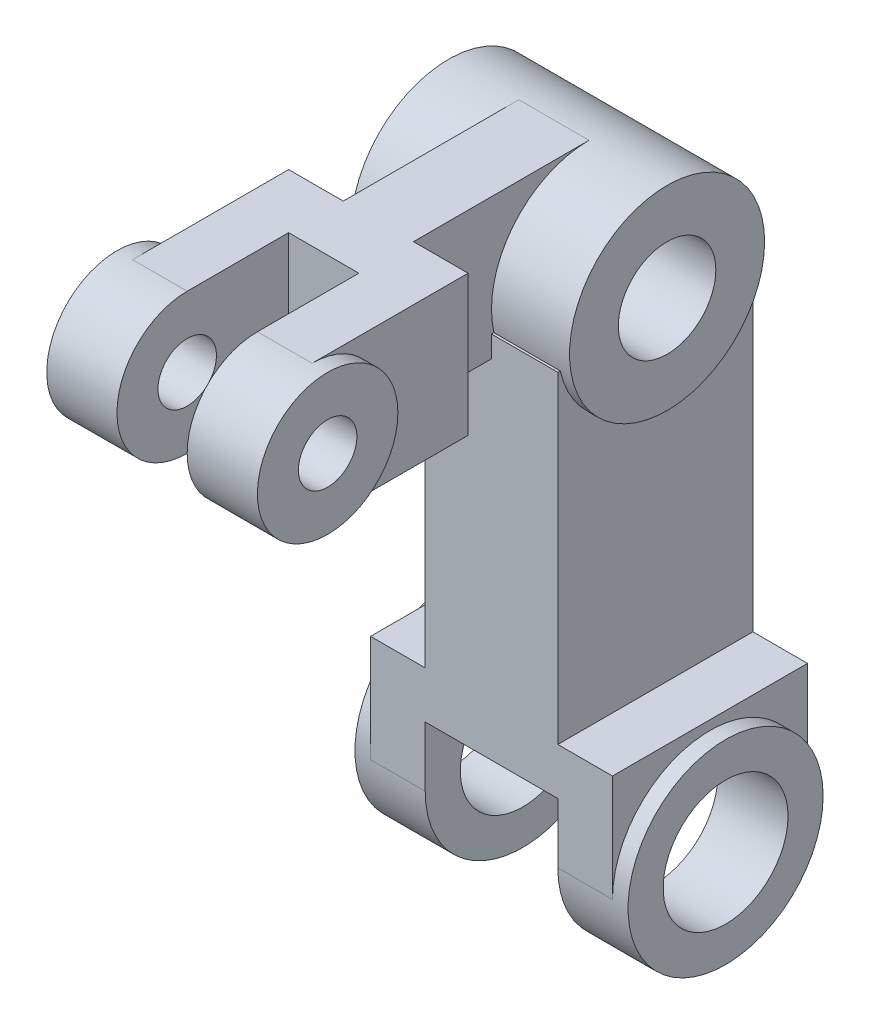
ISO-10303-21;
HEADER;
FILE_DESCRIPTION(('STEP AP214'),'2;1');
FILE_NAME('part.step','',(''),(''),'','','');
FILE_SCHEMA(('AUTOMOTIVE_DESIGN { 1 0 10303 214 1 1 1 1 }'));
ENDSEC;
DATA;
#1=APPLICATION_CONTEXT('core data for automotive mechanical design processes');
#2=APPLICATION_PROTOCOL_DEFINITION('international standard','automotive_design',2000,#1);
#3=PRODUCT_CONTEXT('',#1,'mechanical');
#4=PRODUCT('Part','Part','',(#3));
#5=PRODUCT_RELATED_PRODUCT_CATEGORY('part','',(#4));
#6=PRODUCT_DEFINITION_FORMATION('','',#4);
#7=PRODUCT_DEFINITION_CONTEXT('part definition',#1,'design');
#8=PRODUCT_DEFINITION('design','',#6,#7);
#9=PRODUCT_DEFINITION_SHAPE('','',#8);
#10=(LENGTH_UNIT() NAMED_UNIT(*) SI_UNIT(.MILLI.,.METRE.));
#11=(NAMED_UNIT(*) PLANE_ANGLE_UNIT() SI_UNIT($,.RADIAN.));
#12=(NAMED_UNIT(*) SI_UNIT($,.STERADIAN.) SOLID_ANGLE_UNIT());
#13=UNCERTAINTY_MEASURE_WITH_UNIT(LENGTH_MEASURE(1.E-05),#10,'distance_accuracy_value','');
#14=(GEOMETRIC_REPRESENTATION_CONTEXT(3) GLOBAL_UNCERTAINTY_ASSIGNED_CONTEXT((#13)) GLOBAL_UNIT_ASSIGNED_CONTEXT((#10,
#11,#12)) REPRESENTATION_CONTEXT('',''));
#15=CARTESIAN_POINT('',(0.,0.,0.));
#16=DIRECTION('',(0.,0.,1.));
#17=DIRECTION('',(1.,0.,0.));
#18=AXIS2_PLACEMENT_3D('',#15,#16,#17);
#19=CARTESIAN_POINT('',(-17.,15.39,25.));
#20=DIRECTION('',(0.,1.,0.));
#21=DIRECTION('',(0.,0.,1.));
#22=AXIS2_PLACEMENT_3D('',#19,#20,#21);
#23=PLANE('',#22);
#24=DIRECTION('',(0.,0.,-1.));
#25=VECTOR('',#24,1.);
#26=CARTESIAN_POINT('',(-17.,15.39,25.));
#27=LINE('',#26,#25);
#28=CARTESIAN_POINT('',(-17.,15.39,25.));
#29=VERTEX_POINT('',#28);
#30=CARTESIAN_POINT('',(-17.,15.39,4.37583134958378));
#31=VERTEX_POINT('',#30);
#32=EDGE_CURVE('E253',#29,#31,#27,.T.);
#33=ORIENTED_EDGE('',*,*,#32,.T.);
#34=DIRECTION('',(1.,0.,0.));
#35=VECTOR('',#34,1.);
#36=CARTESIAN_POINT('',(35.,15.39,4.37583134958378));
#37=LINE('',#36,#35);
#38=CARTESIAN_POINT('',(17.,15.39,4.37583134958378));
#39=VERTEX_POINT('',#38);
#40=EDGE_CURVE('E238',#31,#39,#37,.T.);
#41=ORIENTED_EDGE('',*,*,#40,.T.);
#42=DIRECTION('',(0.,0.,-1.));
#43=VECTOR('',#42,1.);
#44=CARTESIAN_POINT('',(17.,15.39,25.));
#45=LINE('',#44,#43);
#46=CARTESIAN_POINT('',(17.,15.39,25.));
#47=VERTEX_POINT('',#46);
#48=EDGE_CURVE('E250',#47,#39,#45,.T.);
#49=ORIENTED_EDGE('',*,*,#48,.F.);
#50=DIRECTION('',(1.,0.,0.));
#51=VECTOR('',#50,1.);
#52=CARTESIAN_POINT('',(-17.,15.39,25.));
#53=LINE('',#52,#51);
#54=EDGE_CURVE('E545',#29,#47,#53,.T.);
#55=ORIENTED_EDGE('',*,*,#54,.F.);
#56=EDGE_LOOP('',(#33,#41,#49,#55));
#57=FACE_BOUND('',#56,.T.);
#58=ADVANCED_FACE('F45',(#57),#23,.F.);
#59=CARTESIAN_POINT('',(-17.,110.,25.));
#60=DIRECTION('',(0.,-1.,0.));
#61=DIRECTION('',(0.,0.,-1.));
#62=AXIS2_PLACEMENT_3D('',#59,#60,#61);
#63=PLANE('',#62);
#64=DIRECTION('',(0.,0.,-1.));
#65=VECTOR('',#64,1.);
#66=CARTESIAN_POINT('',(-17.,110.,25.));
#67=LINE('',#66,#65);
#68=CARTESIAN_POINT('',(-17.,110.,-24.3874967965144));
#69=VERTEX_POINT('',#68);
#70=CARTESIAN_POINT('',(-17.,110.,-25.));
#71=VERTEX_POINT('',#70);
#72=EDGE_CURVE('E349',#69,#71,#67,.T.);
#73=ORIENTED_EDGE('',*,*,#72,.F.);
#74=DIRECTION('',(1.,0.,0.));
#75=VECTOR('',#74,1.);
#76=CARTESIAN_POINT('',(-36.,110.,-24.3874967965144));
#77=LINE('',#76,#75);
#78=CARTESIAN_POINT('',(17.,110.,-24.3874967965144));
#79=VERTEX_POINT('',#78);
#80=EDGE_CURVE('E390',#69,#79,#77,.T.);
#81=ORIENTED_EDGE('',*,*,#80,.T.);
#82=DIRECTION('',(0.,0.,-1.));
#83=VECTOR('',#82,1.);
#84=CARTESIAN_POINT('',(17.,110.,25.));
#85=LINE('',#84,#83);
#86=CARTESIAN_POINT('',(17.,110.,-25.));
#87=VERTEX_POINT('',#86);
#88=EDGE_CURVE('E352',#79,#87,#85,.T.);
#89=ORIENTED_EDGE('',*,*,#88,.T.);
#90=DIRECTION('',(-1.,0.,0.));
#91=VECTOR('',#90,1.);
#92=CARTESIAN_POINT('',(-17.,110.,-25.));
#93=LINE('',#92,#91);
#94=EDGE_CURVE('E333',#87,#71,#93,.T.);
#95=ORIENTED_EDGE('',*,*,#94,.T.);
#96=EDGE_LOOP('',(#73,#81,#89,#95));
#97=FACE_BOUND('',#96,.T.);
#98=ADVANCED_FACE('F389',(#97),#63,.F.);
#99=CARTESIAN_POINT('',(-31.,27.39,25.));
#100=DIRECTION('',(1.,0.,0.));
#101=DIRECTION('',(0.,1.,0.));
#102=AXIS2_PLACEMENT_3D('',#99,#100,#101);
#103=PLANE('',#102);
#104=DIRECTION('',(0.,-1.,0.));
#105=VECTOR('',#104,1.);
#106=CARTESIAN_POINT('',(-31.,27.39,-25.));
#107=LINE('',#106,#105);
#108=CARTESIAN_POINT('',(-31.,27.39,-25.));
#109=VERTEX_POINT('',#108);
#110=CARTESIAN_POINT('',(-31.,0.,-25.));
#111=VERTEX_POINT('',#110);
#112=EDGE_CURVE('E299',#109,#111,#107,.T.);
#113=ORIENTED_EDGE('',*,*,#112,.T.);
#114=CARTESIAN_POINT('',(-31.,0.,0.));
#115=DIRECTION('',(1.,0.,0.));
#116=DIRECTION('',(0.,1.,0.));
#117=AXIS2_PLACEMENT_3D('',#114,#115,#116);
#118=CIRCLE('',#117,25.);
#119=CARTESIAN_POINT('',(-31.,0.,25.));
#120=VERTEX_POINT('',#119);
#121=EDGE_CURVE('E304',#111,#120,#118,.T.);
#122=ORIENTED_EDGE('',*,*,#121,.T.);
#123=DIRECTION('',(0.,-1.,0.));
#124=VECTOR('',#123,1.);
#125=CARTESIAN_POINT('',(-31.,27.39,25.));
#126=LINE('',#125,#124);
#127=CARTESIAN_POINT('',(-31.,27.39,25.));
#128=VERTEX_POINT('',#127);
#129=EDGE_CURVE('E343',#128,#120,#126,.T.);
#130=ORIENTED_EDGE('',*,*,#129,.F.);
#131=DIRECTION('',(0.,0.,-1.));
#132=VECTOR('',#131,1.);
#133=CARTESIAN_POINT('',(-31.,27.39,25.));
#134=LINE('',#133,#132);
#135=EDGE_CURVE('E293',#128,#109,#134,.T.);
#136=ORIENTED_EDGE('',*,*,#135,.T.);
#137=EDGE_LOOP('',(#113,#122,#130,#136));
#138=FACE_BOUND('',#137,.T.);
#139=ADVANCED_FACE('F47',(#138),#103,.F.);
#140=CARTESIAN_POINT('',(-17.,0.,25.));
#141=DIRECTION('',(-1.,0.,0.));
#142=DIRECTION('',(0.,0.,1.));
#143=AXIS2_PLACEMENT_3D('',#140,#141,#142);
#144=PLANE('',#143);
#145=CARTESIAN_POINT('',(-17.,15.39,-4.37583134958378));
#146=VERTEX_POINT('',#145);
#147=CARTESIAN_POINT('',(-17.,15.39,-25.));
#148=VERTEX_POINT('',#147);
#149=EDGE_CURVE('E261',#146,#148,#27,.T.);
#150=ORIENTED_EDGE('',*,*,#149,.F.);
#151=CARTESIAN_POINT('',(-17.,0.,0.));
#152=DIRECTION('',(-1.,0.,0.));
#153=DIRECTION('',(0.,0.,1.));
#154=AXIS2_PLACEMENT_3D('',#151,#152,#153);
#155=CIRCLE('',#154,16.);
#156=EDGE_CURVE('E255',#146,#31,#155,.T.);
#157=ORIENTED_EDGE('',*,*,#156,.T.);
#158=ORIENTED_EDGE('',*,*,#32,.F.);
#159=DIRECTION('',(0.,1.,0.));
#160=VECTOR('',#159,1.);
#161=CARTESIAN_POINT('',(-17.,0.,25.));
#162=LINE('',#161,#160);
#163=CARTESIAN_POINT('',(-17.,0.,25.));
#164=VERTEX_POINT('',#163);
#165=EDGE_CURVE('E542',#164,#29,#162,.T.);
#166=ORIENTED_EDGE('',*,*,#165,.F.);
#167=CARTESIAN_POINT('',(-17.,0.,0.));
#168=DIRECTION('',(1.,0.,0.));
#169=DIRECTION('',(0.,0.,-1.));
#170=AXIS2_PLACEMENT_3D('',#167,#168,#169);
#171=CIRCLE('',#170,25.);
#172=CARTESIAN_POINT('',(-17.,0.,-25.));
#173=VERTEX_POINT('',#172);
#174=EDGE_CURVE('E526',#164,#173,#171,.T.);
#175=ORIENTED_EDGE('',*,*,#174,.T.);
#176=DIRECTION('',(0.,1.,0.));
#177=VECTOR('',#176,1.);
#178=CARTESIAN_POINT('',(-17.,0.,-25.));
#179=LINE('',#178,#177);
#180=EDGE_CURVE('E308',#173,#148,#179,.T.);
#181=ORIENTED_EDGE('',*,*,#180,.T.);
#182=EDGE_LOOP('',(#150,#157,#158,#166,#175,#181));
#183=FACE_BOUND('',#182,.T.);
#184=ADVANCED_FACE('F679',(#183),#144,.F.);
#185=CARTESIAN_POINT('',(17.,15.39,-4.37583134958378));
#186=VERTEX_POINT('',#185);
#187=CARTESIAN_POINT('',(17.,15.39,-25.));
#188=VERTEX_POINT('',#187);
#189=EDGE_CURVE('E262',#186,#188,#45,.T.);
#190=ORIENTED_EDGE('',*,*,#189,.F.);
#191=DIRECTION('',(1.,0.,0.));
#192=VECTOR('',#191,1.);
#193=CARTESIAN_POINT('',(35.,15.39,-4.37583134958378));
#194=LINE('',#193,#192);
#195=EDGE_CURVE('E61',#186,#146,#194,.F.);
#196=ORIENTED_EDGE('',*,*,#195,.T.);
#197=ORIENTED_EDGE('',*,*,#149,.T.);
#198=DIRECTION('',(1.,0.,0.));
#199=VECTOR('',#198,1.);
#200=CARTESIAN_POINT('',(-17.,15.39,-25.));
#201=LINE('',#200,#199);
#202=EDGE_CURVE('E312',#148,#188,#201,.T.);
#203=ORIENTED_EDGE('',*,*,#202,.T.);
#204=EDGE_LOOP('',(#190,#196,#197,#203));
#205=FACE_BOUND('',#204,.T.);
#206=ADVANCED_FACE('F670',(#205),#23,.F.);
#207=CARTESIAN_POINT('',(17.,15.39,25.));
#208=DIRECTION('',(1.,0.,0.));
#209=DIRECTION('',(0.,0.,-1.));
#210=AXIS2_PLACEMENT_3D('',#207,#208,#209);
#211=PLANE('',#210);
#212=ORIENTED_EDGE('',*,*,#48,.T.);
#213=CARTESIAN_POINT('',(17.,0.,0.));
#214=DIRECTION('',(1.,0.,0.));
#215=DIRECTION('',(0.,0.,-1.));
#216=AXIS2_PLACEMENT_3D('',#213,#214,#215);
#217=CIRCLE('',#216,16.);
#218=EDGE_CURVE('E235',#39,#186,#217,.T.);
#219=ORIENTED_EDGE('',*,*,#218,.T.);
#220=ORIENTED_EDGE('',*,*,#189,.T.);
#221=DIRECTION('',(0.,-1.,0.));
#222=VECTOR('',#221,1.);
#223=CARTESIAN_POINT('',(17.,15.39,-25.));
#224=LINE('',#223,#222);
#225=CARTESIAN_POINT('',(17.,0.,-25.));
#226=VERTEX_POINT('',#225);
#227=EDGE_CURVE('E316',#188,#226,#224,.T.);
#228=ORIENTED_EDGE('',*,*,#227,.T.);
#229=CARTESIAN_POINT('',(17.,0.,0.));
#230=DIRECTION('',(1.,0.,0.));
#231=DIRECTION('',(0.,0.,-1.));
#232=AXIS2_PLACEMENT_3D('',#229,#230,#231);
#233=CIRCLE('',#232,25.);
#234=CARTESIAN_POINT('',(17.,0.,25.));
#235=VERTEX_POINT('',#234);
#236=EDGE_CURVE('E514',#235,#226,#233,.T.);
#237=ORIENTED_EDGE('',*,*,#236,.F.);
#238=DIRECTION('',(0.,-1.,0.));
#239=VECTOR('',#238,1.);
#240=CARTESIAN_POINT('',(17.,15.39,25.));
#241=LINE('',#240,#239);
#242=EDGE_CURVE('E259',#47,#235,#241,.T.);
#243=ORIENTED_EDGE('',*,*,#242,.F.);
#244=EDGE_LOOP('',(#212,#219,#220,#228,#237,#243));
#245=FACE_BOUND('',#244,.T.);
#246=ADVANCED_FACE('F257',(#245),#211,.F.);
#247=CARTESIAN_POINT('',(31.,27.39,25.));
#248=DIRECTION('',(-1.,0.,0.));
#249=DIRECTION('',(0.,0.,1.));
#250=AXIS2_PLACEMENT_3D('',#247,#248,#249);
#251=PLANE('',#250);
#252=CARTESIAN_POINT('',(31.,0.,0.));
#253=DIRECTION('',(-1.,0.,0.));
#254=DIRECTION('',(0.,0.,1.));
#255=AXIS2_PLACEMENT_3D('',#252,#253,#254);
#256=CIRCLE('',#255,25.);
#257=CARTESIAN_POINT('',(31.,0.,-25.));
#258=VERTEX_POINT('',#257);
#259=CARTESIAN_POINT('',(31.,0.,25.));
#260=VERTEX_POINT('',#259);
#261=EDGE_CURVE('E519',#258,#260,#256,.F.);
#262=ORIENTED_EDGE('',*,*,#261,.F.);
#263=DIRECTION('',(0.,1.,0.));
#264=VECTOR('',#263,1.);
#265=CARTESIAN_POINT('',(31.,27.39,-25.));
#266=LINE('',#265,#264);
#267=CARTESIAN_POINT('',(31.,27.39,-25.));
#268=VERTEX_POINT('',#267);
#269=EDGE_CURVE('E323',#258,#268,#266,.T.);
#270=ORIENTED_EDGE('',*,*,#269,.T.);
#271=DIRECTION('',(0.,0.,-1.));
#272=VECTOR('',#271,1.);
#273=CARTESIAN_POINT('',(31.,27.39,25.));
#274=LINE('',#273,#272);
#275=CARTESIAN_POINT('',(31.,27.39,25.));
#276=VERTEX_POINT('',#275);
#277=EDGE_CURVE('E267',#276,#268,#274,.T.);
#278=ORIENTED_EDGE('',*,*,#277,.F.);
#279=DIRECTION('',(0.,1.,0.));
#280=VECTOR('',#279,1.);
#281=CARTESIAN_POINT('',(31.,27.39,25.));
#282=LINE('',#281,#280);
#283=EDGE_CURVE('E553',#260,#276,#282,.T.);
#284=ORIENTED_EDGE('',*,*,#283,.F.);
#285=EDGE_LOOP('',(#262,#270,#278,#284));
#286=FACE_BOUND('',#285,.T.);
#287=ADVANCED_FACE('F684',(#286),#251,.F.);
#288=CARTESIAN_POINT('',(17.,27.39,25.));
#289=DIRECTION('',(0.,-1.,0.));
#290=DIRECTION('',(1.,0.,0.));
#291=AXIS2_PLACEMENT_3D('',#288,#289,#290);
#292=PLANE('',#291);
#293=DIRECTION('',(-1.,0.,0.));
#294=VECTOR('',#293,1.);
#295=CARTESIAN_POINT('',(17.,27.39,-25.));
#296=LINE('',#295,#294);
#297=CARTESIAN_POINT('',(17.,27.39,-25.));
#298=VERTEX_POINT('',#297);
#299=EDGE_CURVE('E326',#268,#298,#296,.T.);
#300=ORIENTED_EDGE('',*,*,#299,.T.);
#301=DIRECTION('',(0.,0.,-1.));
#302=VECTOR('',#301,1.);
#303=CARTESIAN_POINT('',(17.,27.39,25.));
#304=LINE('',#303,#302);
#305=CARTESIAN_POINT('',(17.,27.39,25.));
#306=VERTEX_POINT('',#305);
#307=EDGE_CURVE('E356',#306,#298,#304,.T.);
#308=ORIENTED_EDGE('',*,*,#307,.F.);
#309=DIRECTION('',(-1.,0.,0.));
#310=VECTOR('',#309,1.);
#311=CARTESIAN_POINT('',(17.,27.39,25.));
#312=LINE('',#311,#310);
#313=EDGE_CURVE('E370',#276,#306,#312,.T.);
#314=ORIENTED_EDGE('',*,*,#313,.F.);
#315=ORIENTED_EDGE('',*,*,#277,.T.);
#316=EDGE_LOOP('',(#300,#308,#314,#315));
#317=FACE_BOUND('',#316,.T.);
#318=ADVANCED_FACE('F369',(#317),#292,.F.);
#319=CARTESIAN_POINT('',(17.,110.,25.));
#320=DIRECTION('',(-1.,0.,0.));
#321=DIRECTION('',(0.,-1.,0.));
#322=AXIS2_PLACEMENT_3D('',#319,#320,#321);
#323=PLANE('',#322);
#324=ORIENTED_EDGE('',*,*,#88,.F.);
#325=CARTESIAN_POINT('',(17.,115.5,0.));
#326=DIRECTION('',(-1.,0.,0.));
#327=DIRECTION('',(0.,-1.,0.));
#328=AXIS2_PLACEMENT_3D('',#325,#326,#327);
#329=CIRCLE('',#328,25.);
#330=CARTESIAN_POINT('',(17.,110.,24.3874967965144));
#331=VERTEX_POINT('',#330);
#332=EDGE_CURVE('E384',#79,#331,#329,.T.);
#333=ORIENTED_EDGE('',*,*,#332,.T.);
#334=CARTESIAN_POINT('',(17.,110.,25.));
#335=VERTEX_POINT('',#334);
#336=EDGE_CURVE('E353',#335,#331,#85,.T.);
#337=ORIENTED_EDGE('',*,*,#336,.F.);
#338=DIRECTION('',(0.,1.,0.));
#339=VECTOR('',#338,1.);
#340=CARTESIAN_POINT('',(17.,110.,25.));
#341=LINE('',#340,#339);
#342=EDGE_CURVE('E295',#306,#335,#341,.T.);
#343=ORIENTED_EDGE('',*,*,#342,.F.);
#344=ORIENTED_EDGE('',*,*,#307,.T.);
#345=DIRECTION('',(0.,1.,0.));
#346=VECTOR('',#345,1.);
#347=CARTESIAN_POINT('',(17.,110.,-25.));
#348=LINE('',#347,#346);
#349=EDGE_CURVE('E329',#298,#87,#348,.T.);
#350=ORIENTED_EDGE('',*,*,#349,.T.);
#351=EDGE_LOOP('',(#324,#333,#337,#343,#344,#350));
#352=FACE_BOUND('',#351,.T.);
#353=ADVANCED_FACE('F381',(#352),#323,.F.);
#354=ORIENTED_EDGE('',*,*,#336,.T.);
#355=DIRECTION('',(1.,0.,0.));
#356=VECTOR('',#355,1.);
#357=CARTESIAN_POINT('',(-36.,110.,24.3874967965144));
#358=LINE('',#357,#356);
#359=CARTESIAN_POINT('',(0.,110.,24.3874967965144));
#360=VERTEX_POINT('',#359);
#361=EDGE_CURVE('E393',#331,#360,#358,.F.);
#362=ORIENTED_EDGE('',*,*,#361,.T.);
#363=DIRECTION('',(0.,0.,1.));
#364=VECTOR('',#363,1.);
#365=CARTESIAN_POINT('',(0.,110.,25.));
#366=LINE('',#365,#364);
#367=CARTESIAN_POINT('',(0.,110.,25.));
#368=VERTEX_POINT('',#367);
#369=EDGE_CURVE('E511',#360,#368,#366,.T.);
#370=ORIENTED_EDGE('',*,*,#369,.T.);
#371=DIRECTION('',(-1.,0.,0.));
#372=VECTOR('',#371,1.);
#373=CARTESIAN_POINT('',(-17.,110.,25.));
#374=LINE('',#373,#372);
#375=EDGE_CURVE('E289',#335,#368,#374,.T.);
#376=ORIENTED_EDGE('',*,*,#375,.F.);
#377=EDGE_LOOP('',(#354,#362,#370,#376));
#378=FACE_BOUND('',#377,.T.);
#379=ADVANCED_FACE('F560',(#378),#63,.F.);
#380=CARTESIAN_POINT('',(-17.,110.,25.));
#381=DIRECTION('',(1.,0.,0.));
#382=DIRECTION('',(0.,1.,0.));
#383=AXIS2_PLACEMENT_3D('',#380,#381,#382);
#384=PLANE('',#383);
#385=DIRECTION('',(0.,0.,1.));
#386=VECTOR('',#385,1.);
#387=CARTESIAN_POINT('',(-17.,104.5,25.));
#388=LINE('',#387,#386);
#389=CARTESIAN_POINT('',(-17.,104.5,22.4499443206436));
#390=VERTEX_POINT('',#389);
#391=CARTESIAN_POINT('',(-17.,104.5,25.));
#392=VERTEX_POINT('',#391);
#393=EDGE_CURVE('E69',#390,#392,#388,.T.);
#394=ORIENTED_EDGE('',*,*,#393,.F.);
#395=CARTESIAN_POINT('',(-17.,115.5,0.));
#396=DIRECTION('',(1.,0.,0.));
#397=DIRECTION('',(0.,1.,0.));
#398=AXIS2_PLACEMENT_3D('',#395,#396,#397);
#399=CIRCLE('',#398,25.);
#400=EDGE_CURVE('E400',#390,#69,#399,.T.);
#401=ORIENTED_EDGE('',*,*,#400,.T.);
#402=ORIENTED_EDGE('',*,*,#72,.T.);
#403=DIRECTION('',(0.,-1.,0.));
#404=VECTOR('',#403,1.);
#405=CARTESIAN_POINT('',(-17.,110.,-25.));
#406=LINE('',#405,#404);
#407=CARTESIAN_POINT('',(-17.,27.39,-25.));
#408=VERTEX_POINT('',#407);
#409=EDGE_CURVE('E337',#71,#408,#406,.T.);
#410=ORIENTED_EDGE('',*,*,#409,.T.);
#411=DIRECTION('',(0.,0.,-1.));
#412=VECTOR('',#411,1.);
#413=CARTESIAN_POINT('',(-17.,27.39,25.));
#414=LINE('',#413,#412);
#415=CARTESIAN_POINT('',(-17.,27.39,25.));
#416=VERTEX_POINT('',#415);
#417=EDGE_CURVE('E285',#416,#408,#414,.T.);
#418=ORIENTED_EDGE('',*,*,#417,.F.);
#419=DIRECTION('',(0.,-1.,0.));
#420=VECTOR('',#419,1.);
#421=CARTESIAN_POINT('',(-17.,110.,25.));
#422=LINE('',#421,#420);
#423=EDGE_CURVE('E276',#392,#416,#422,.T.);
#424=ORIENTED_EDGE('',*,*,#423,.F.);
#425=EDGE_LOOP('',(#394,#401,#402,#410,#418,#424));
#426=FACE_BOUND('',#425,.T.);
#427=ADVANCED_FACE('F282',(#426),#384,.F.);
#428=CARTESIAN_POINT('',(-17.,27.39,25.));
#429=DIRECTION('',(0.,-1.,0.));
#430=DIRECTION('',(0.,0.,-1.));
#431=AXIS2_PLACEMENT_3D('',#428,#429,#430);
#432=PLANE('',#431);
#433=DIRECTION('',(-1.,0.,0.));
#434=VECTOR('',#433,1.);
#435=CARTESIAN_POINT('',(-17.,27.39,-25.));
#436=LINE('',#435,#434);
#437=EDGE_CURVE('E340',#408,#109,#436,.T.);
#438=ORIENTED_EDGE('',*,*,#437,.T.);
#439=ORIENTED_EDGE('',*,*,#135,.F.);
#440=DIRECTION('',(-1.,0.,0.));
#441=VECTOR('',#440,1.);
#442=CARTESIAN_POINT('',(-17.,27.39,25.));
#443=LINE('',#442,#441);
#444=EDGE_CURVE('E288',#416,#128,#443,.T.);
#445=ORIENTED_EDGE('',*,*,#444,.F.);
#446=ORIENTED_EDGE('',*,*,#417,.T.);
#447=EDGE_LOOP('',(#438,#439,#445,#446));
#448=FACE_BOUND('',#447,.T.);
#449=ADVANCED_FACE('F706',(#448),#432,.F.);
#450=CARTESIAN_POINT('',(0.,0.,25.));
#451=DIRECTION('',(0.,0.,1.));
#452=DIRECTION('',(1.,0.,0.));
#453=AXIS2_PLACEMENT_3D('',#450,#451,#452);
#454=PLANE('',#453);
#455=DIRECTION('',(0.,1.,0.));
#456=VECTOR('',#455,1.);
#457=CARTESIAN_POINT('',(0.,0.,25.));
#458=LINE('',#457,#456);
#459=CARTESIAN_POINT('',(0.,104.5,25.));
#460=VERTEX_POINT('',#459);
#461=EDGE_CURVE('E11',#460,#368,#458,.T.);
#462=ORIENTED_EDGE('',*,*,#461,.F.);
#463=DIRECTION('',(-1.,0.,0.));
#464=VECTOR('',#463,1.);
#465=CARTESIAN_POINT('',(0.,104.5,25.));
#466=LINE('',#465,#464);
#467=EDGE_CURVE('E54',#460,#392,#466,.T.);
#468=ORIENTED_EDGE('',*,*,#467,.T.);
#469=ORIENTED_EDGE('',*,*,#423,.T.);
#470=ORIENTED_EDGE('',*,*,#444,.T.);
#471=ORIENTED_EDGE('',*,*,#129,.T.);
#472=DIRECTION('',(1.,0.,0.));
#473=VECTOR('',#472,1.);
#474=CARTESIAN_POINT('',(-31.,0.,25.));
#475=LINE('',#474,#473);
#476=EDGE_CURVE('E539',#120,#164,#475,.T.);
#477=ORIENTED_EDGE('',*,*,#476,.T.);
#478=ORIENTED_EDGE('',*,*,#165,.T.);
#479=ORIENTED_EDGE('',*,*,#54,.T.);
#480=ORIENTED_EDGE('',*,*,#242,.T.);
#481=DIRECTION('',(1.,0.,0.));
#482=VECTOR('',#481,1.);
#483=CARTESIAN_POINT('',(17.,0.,25.));
#484=LINE('',#483,#482);
#485=EDGE_CURVE('E550',#235,#260,#484,.T.);
#486=ORIENTED_EDGE('',*,*,#485,.T.);
#487=ORIENTED_EDGE('',*,*,#283,.T.);
#488=ORIENTED_EDGE('',*,*,#313,.T.);
#489=ORIENTED_EDGE('',*,*,#342,.T.);
#490=ORIENTED_EDGE('',*,*,#375,.T.);
#491=EDGE_LOOP('',(#462,#468,#469,#470,#471,#477,#478,#479,#480,#486,#487,#488,#489,#490));
#492=FACE_BOUND('',#491,.T.);
#493=ADVANCED_FACE('F275',(#492),#454,.T.);
#494=CARTESIAN_POINT('',(0.,0.,-25.));
#495=DIRECTION('',(0.,0.,1.));
#496=DIRECTION('',(1.,0.,0.));
#497=AXIS2_PLACEMENT_3D('',#494,#495,#496);
#498=PLANE('',#497);
#499=ORIENTED_EDGE('',*,*,#112,.F.);
#500=ORIENTED_EDGE('',*,*,#437,.F.);
#501=ORIENTED_EDGE('',*,*,#409,.F.);
#502=ORIENTED_EDGE('',*,*,#94,.F.);
#503=ORIENTED_EDGE('',*,*,#349,.F.);
#504=ORIENTED_EDGE('',*,*,#299,.F.);
#505=ORIENTED_EDGE('',*,*,#269,.F.);
#506=DIRECTION('',(1.,0.,0.));
#507=VECTOR('',#506,1.);
#508=CARTESIAN_POINT('',(17.,0.,-25.));
#509=LINE('',#508,#507);
#510=EDGE_CURVE('E319',#226,#258,#509,.T.);
#511=ORIENTED_EDGE('',*,*,#510,.F.);
#512=ORIENTED_EDGE('',*,*,#227,.F.);
#513=ORIENTED_EDGE('',*,*,#202,.F.);
#514=ORIENTED_EDGE('',*,*,#180,.F.);
#515=DIRECTION('',(1.,0.,0.));
#516=VECTOR('',#515,1.);
#517=CARTESIAN_POINT('',(-31.,0.,-25.));
#518=LINE('',#517,#516);
#519=EDGE_CURVE('E303',#111,#173,#518,.T.);
#520=ORIENTED_EDGE('',*,*,#519,.F.);
#521=EDGE_LOOP('',(#499,#500,#501,#502,#503,#504,#505,#511,#512,#513,#514,#520));
#522=FACE_BOUND('',#521,.T.);
#523=ADVANCED_FACE('F375',(#522),#498,.F.);
#524=CARTESIAN_POINT('',(-35.,0.,0.));
#525=DIRECTION('',(1.,0.,0.));
#526=DIRECTION('',(0.,0.,-1.));
#527=AXIS2_PLACEMENT_3D('',#524,#525,#526);
#528=CYLINDRICAL_SURFACE('',#527,25.);
#529=CARTESIAN_POINT('',(-35.,0.,0.));
#530=DIRECTION('',(1.,0.,0.));
#531=DIRECTION('',(0.,0.,-1.));
#532=AXIS2_PLACEMENT_3D('',#529,#530,#531);
#533=CIRCLE('',#532,25.);
#534=CARTESIAN_POINT('',(-35.,0.,-25.));
#535=VERTEX_POINT('',#534);
#536=EDGE_CURVE('E527',#535,#535,#533,.T.);
#537=ORIENTED_EDGE('',*,*,#536,.T.);
#538=EDGE_LOOP('',(#537));
#539=FACE_BOUND('',#538,.T.);
#540=ORIENTED_EDGE('',*,*,#476,.F.);
#541=ORIENTED_EDGE('',*,*,#121,.F.);
#542=ORIENTED_EDGE('',*,*,#519,.T.);
#543=ORIENTED_EDGE('',*,*,#174,.F.);
#544=EDGE_LOOP('',(#540,#541,#542,#543));
#545=FACE_BOUND('',#544,.T.);
#546=ADVANCED_FACE('F711',(#539,#545),#528,.T.);
#547=CARTESIAN_POINT('',(-35.,0.,0.));
#548=DIRECTION('',(1.,0.,0.));
#549=DIRECTION('',(0.,0.,-1.));
#550=AXIS2_PLACEMENT_3D('',#547,#548,#549);
#551=PLANE('',#550);
#552=CARTESIAN_POINT('',(-35.,0.,0.));
#553=DIRECTION('',(1.,0.,0.));
#554=DIRECTION('',(0.,0.,-1.));
#555=AXIS2_PLACEMENT_3D('',#552,#553,#554);
#556=CIRCLE('',#555,16.);
#557=CARTESIAN_POINT('',(-35.,0.,-16.));
#558=VERTEX_POINT('',#557);
#559=EDGE_CURVE('E244',#558,#558,#556,.T.);
#560=ORIENTED_EDGE('',*,*,#559,.T.);
#561=EDGE_LOOP('',(#560));
#562=FACE_BOUND('',#561,.T.);
#563=ORIENTED_EDGE('',*,*,#536,.F.);
#564=EDGE_LOOP('',(#563));
#565=FACE_BOUND('',#564,.T.);
#566=ADVANCED_FACE('F715',(#562,#565),#551,.F.);
#567=CARTESIAN_POINT('',(35.,0.,0.));
#568=DIRECTION('',(-1.,0.,0.));
#569=DIRECTION('',(0.,0.,1.));
#570=AXIS2_PLACEMENT_3D('',#567,#568,#569);
#571=CYLINDRICAL_SURFACE('',#570,25.);
#572=CARTESIAN_POINT('',(35.,0.,0.));
#573=DIRECTION('',(1.,0.,0.));
#574=DIRECTION('',(0.,0.,-1.));
#575=AXIS2_PLACEMENT_3D('',#572,#573,#574);
#576=CIRCLE('',#575,25.);
#577=CARTESIAN_POINT('',(35.,0.,-25.));
#578=VERTEX_POINT('',#577);
#579=EDGE_CURVE('E515',#578,#578,#576,.T.);
#580=ORIENTED_EDGE('',*,*,#579,.F.);
#581=EDGE_LOOP('',(#580));
#582=FACE_BOUND('',#581,.T.);
#583=ORIENTED_EDGE('',*,*,#261,.T.);
#584=ORIENTED_EDGE('',*,*,#485,.F.);
#585=ORIENTED_EDGE('',*,*,#236,.T.);
#586=ORIENTED_EDGE('',*,*,#510,.T.);
#587=EDGE_LOOP('',(#583,#584,#585,#586));
#588=FACE_BOUND('',#587,.T.);
#589=ADVANCED_FACE('F691',(#582,#588),#571,.T.);
#590=CARTESIAN_POINT('',(35.,0.,0.));
#591=DIRECTION('',(-1.,0.,0.));
#592=DIRECTION('',(0.,0.,-1.));
#593=AXIS2_PLACEMENT_3D('',#590,#591,#592);
#594=PLANE('',#593);
#595=CARTESIAN_POINT('',(35.,0.,0.));
#596=DIRECTION('',(1.,0.,0.));
#597=DIRECTION('',(0.,0.,-1.));
#598=AXIS2_PLACEMENT_3D('',#595,#596,#597);
#599=CIRCLE('',#598,16.);
#600=CARTESIAN_POINT('',(35.,0.,-16.));
#601=VERTEX_POINT('',#600);
#602=EDGE_CURVE('E767',#601,#601,#599,.T.);
#603=ORIENTED_EDGE('',*,*,#602,.F.);
#604=EDGE_LOOP('',(#603));
#605=FACE_BOUND('',#604,.T.);
#606=ORIENTED_EDGE('',*,*,#579,.T.);
#607=EDGE_LOOP('',(#606));
#608=FACE_BOUND('',#607,.T.);
#609=ADVANCED_FACE('F722',(#605,#608),#594,.F.);
#610=CARTESIAN_POINT('',(0.,104.5,0.));
#611=DIRECTION('',(1.,0.,0.));
#612=DIRECTION('',(0.,0.,-1.));
#613=AXIS2_PLACEMENT_3D('',#610,#611,#612);
#614=PLANE('',#613);
#615=CARTESIAN_POINT('',(0.,115.5,0.));
#616=DIRECTION('',(1.,0.,0.));
#617=DIRECTION('',(0.,0.,-1.));
#618=AXIS2_PLACEMENT_3D('',#615,#616,#617);
#619=CIRCLE('',#618,25.);
#620=CARTESIAN_POINT('',(0.,140.5,0.));
#621=VERTEX_POINT('',#620);
#622=EDGE_CURVE('E632',#621,#360,#619,.T.);
#623=ORIENTED_EDGE('',*,*,#622,.F.);
#624=DIRECTION('',(0.,0.,-1.));
#625=VECTOR('',#624,1.);
#626=CARTESIAN_POINT('',(0.,140.5,0.));
#627=LINE('',#626,#625);
#628=CARTESIAN_POINT('',(0.,140.5,45.));
#629=VERTEX_POINT('',#628);
#630=EDGE_CURVE('E397',#629,#621,#627,.T.);
#631=ORIENTED_EDGE('',*,*,#630,.F.);
#632=DIRECTION('',(0.,1.,0.));
#633=VECTOR('',#632,1.);
#634=CARTESIAN_POINT('',(0.,104.5,45.));
#635=LINE('',#634,#633);
#636=CARTESIAN_POINT('',(0.,104.5,45.));
#637=VERTEX_POINT('',#636);
#638=EDGE_CURVE('E492',#637,#629,#635,.T.);
#639=ORIENTED_EDGE('',*,*,#638,.F.);
#640=DIRECTION('',(0.,0.,-1.));
#641=VECTOR('',#640,1.);
#642=CARTESIAN_POINT('',(0.,104.5,0.));
#643=LINE('',#642,#641);
#644=EDGE_CURVE('E404',#637,#460,#643,.T.);
#645=ORIENTED_EDGE('',*,*,#644,.T.);
#646=ORIENTED_EDGE('',*,*,#461,.T.);
#647=ORIENTED_EDGE('',*,*,#369,.F.);
#648=EDGE_LOOP('',(#623,#631,#639,#645,#646,#647));
#649=FACE_BOUND('',#648,.T.);
#650=ADVANCED_FACE('F564',(#649),#614,.T.);
#651=CARTESIAN_POINT('',(0.,104.5,0.));
#652=DIRECTION('',(0.,1.,0.));
#653=DIRECTION('',(0.,0.,1.));
#654=AXIS2_PLACEMENT_3D('',#651,#652,#653);
#655=PLANE('',#654);
#656=DIRECTION('',(0.,0.,1.));
#657=VECTOR('',#656,1.);
#658=CARTESIAN_POINT('',(-18.,104.5,45.));
#659=LINE('',#658,#657);
#660=CARTESIAN_POINT('',(-18.,104.5,22.4499443206436));
#661=VERTEX_POINT('',#660);
#662=CARTESIAN_POINT('',(-18.,104.5,45.));
#663=VERTEX_POINT('',#662);
#664=EDGE_CURVE('E407',#661,#663,#659,.T.);
#665=ORIENTED_EDGE('',*,*,#664,.F.);
#666=DIRECTION('',(1.,0.,0.));
#667=VECTOR('',#666,1.);
#668=CARTESIAN_POINT('',(-36.,104.5,22.4499443206436));
#669=LINE('',#668,#667);
#670=EDGE_CURVE('E629',#661,#390,#669,.T.);
#671=ORIENTED_EDGE('',*,*,#670,.T.);
#672=ORIENTED_EDGE('',*,*,#393,.T.);
#673=ORIENTED_EDGE('',*,*,#467,.F.);
#674=ORIENTED_EDGE('',*,*,#644,.F.);
#675=DIRECTION('',(-1.,0.,0.));
#676=VECTOR('',#675,1.);
#677=CARTESIAN_POINT('',(0.,104.5,45.));
#678=LINE('',#677,#676);
#679=CARTESIAN_POINT('',(14.,104.5,45.));
#680=VERTEX_POINT('',#679);
#681=EDGE_CURVE('E441',#680,#637,#678,.T.);
#682=ORIENTED_EDGE('',*,*,#681,.F.);
#683=DIRECTION('',(0.,0.,-1.));
#684=VECTOR('',#683,1.);
#685=CARTESIAN_POINT('',(14.,104.5,45.));
#686=LINE('',#685,#684);
#687=CARTESIAN_POINT('',(14.,104.5,85.));
#688=VERTEX_POINT('',#687);
#689=EDGE_CURVE('E437',#688,#680,#686,.T.);
#690=ORIENTED_EDGE('',*,*,#689,.F.);
#691=DIRECTION('',(1.,0.,0.));
#692=VECTOR('',#691,1.);
#693=CARTESIAN_POINT('',(14.,104.5,85.));
#694=LINE('',#693,#692);
#695=CARTESIAN_POINT('',(0.,104.5,85.));
#696=VERTEX_POINT('',#695);
#697=EDGE_CURVE('E434',#696,#688,#694,.T.);
#698=ORIENTED_EDGE('',*,*,#697,.F.);
#699=DIRECTION('',(0.,0.,1.));
#700=VECTOR('',#699,1.);
#701=CARTESIAN_POINT('',(0.,104.5,85.));
#702=LINE('',#701,#700);
#703=CARTESIAN_POINT('',(0.,104.5,59.));
#704=VERTEX_POINT('',#703);
#705=EDGE_CURVE('E430',#704,#696,#702,.T.);
#706=ORIENTED_EDGE('',*,*,#705,.F.);
#707=DIRECTION('',(1.,0.,0.));
#708=VECTOR('',#707,1.);
#709=CARTESIAN_POINT('',(0.,104.5,59.));
#710=LINE('',#709,#708);
#711=CARTESIAN_POINT('',(-18.,104.5,59.));
#712=VERTEX_POINT('',#711);
#713=EDGE_CURVE('E426',#712,#704,#710,.T.);
#714=ORIENTED_EDGE('',*,*,#713,.F.);
#715=DIRECTION('',(0.,0.,-1.));
#716=VECTOR('',#715,1.);
#717=CARTESIAN_POINT('',(-18.,104.5,59.));
#718=LINE('',#717,#716);
#719=CARTESIAN_POINT('',(-18.,104.5,85.));
#720=VERTEX_POINT('',#719);
#721=EDGE_CURVE('E422',#720,#712,#718,.T.);
#722=ORIENTED_EDGE('',*,*,#721,.F.);
#723=DIRECTION('',(1.,0.,0.));
#724=VECTOR('',#723,1.);
#725=CARTESIAN_POINT('',(-18.,104.5,85.));
#726=LINE('',#725,#724);
#727=CARTESIAN_POINT('',(-32.,104.5,85.));
#728=VERTEX_POINT('',#727);
#729=EDGE_CURVE('E419',#728,#720,#726,.T.);
#730=ORIENTED_EDGE('',*,*,#729,.F.);
#731=DIRECTION('',(0.,0.,1.));
#732=VECTOR('',#731,1.);
#733=CARTESIAN_POINT('',(-32.,104.5,85.));
#734=LINE('',#733,#732);
#735=CARTESIAN_POINT('',(-32.,104.5,45.));
#736=VERTEX_POINT('',#735);
#737=EDGE_CURVE('E415',#736,#728,#734,.T.);
#738=ORIENTED_EDGE('',*,*,#737,.F.);
#739=DIRECTION('',(-1.,0.,0.));
#740=VECTOR('',#739,1.);
#741=CARTESIAN_POINT('',(-32.,104.5,45.));
#742=LINE('',#741,#740);
#743=EDGE_CURVE('E411',#663,#736,#742,.T.);
#744=ORIENTED_EDGE('',*,*,#743,.F.);
#745=EDGE_LOOP('',(#665,#671,#672,#673,#674,#682,#690,#698,#706,#714,#722,#730,#738,#744));
#746=FACE_BOUND('',#745,.T.);
#747=ADVANCED_FACE('F568',(#746),#655,.F.);
#748=CARTESIAN_POINT('',(0.,104.5,45.));
#749=DIRECTION('',(0.,0.,-1.));
#750=DIRECTION('',(-1.,0.,0.));
#751=AXIS2_PLACEMENT_3D('',#748,#749,#750);
#752=PLANE('',#751);
#753=DIRECTION('',(-1.,0.,0.));
#754=VECTOR('',#753,1.);
#755=CARTESIAN_POINT('',(0.,140.5,45.));
#756=LINE('',#755,#754);
#757=CARTESIAN_POINT('',(14.,140.5,45.));
#758=VERTEX_POINT('',#757);
#759=EDGE_CURVE('E408',#758,#629,#756,.T.);
#760=ORIENTED_EDGE('',*,*,#759,.F.);
#761=DIRECTION('',(0.,1.,0.));
#762=VECTOR('',#761,1.);
#763=CARTESIAN_POINT('',(14.,104.5,45.));
#764=LINE('',#763,#762);
#765=EDGE_CURVE('E495',#680,#758,#764,.T.);
#766=ORIENTED_EDGE('',*,*,#765,.F.);
#767=ORIENTED_EDGE('',*,*,#681,.T.);
#768=ORIENTED_EDGE('',*,*,#638,.T.);
#769=EDGE_LOOP('',(#760,#766,#767,#768));
#770=FACE_BOUND('',#769,.T.);
#771=ADVANCED_FACE('F572',(#770),#752,.T.);
#772=CARTESIAN_POINT('',(14.,104.5,45.));
#773=DIRECTION('',(1.,0.,0.));
#774=DIRECTION('',(0.,0.,-1.));
#775=AXIS2_PLACEMENT_3D('',#772,#773,#774);
#776=PLANE('',#775);
#777=DIRECTION('',(0.,0.,-1.));
#778=VECTOR('',#777,1.);
#779=CARTESIAN_POINT('',(14.,140.5,45.));
#780=LINE('',#779,#778);
#781=CARTESIAN_POINT('',(14.,140.5,85.));
#782=VERTEX_POINT('',#781);
#783=EDGE_CURVE('E485',#782,#758,#780,.T.);
#784=ORIENTED_EDGE('',*,*,#783,.F.);
#785=CARTESIAN_POINT('',(14.,122.5,85.));
#786=DIRECTION('',(1.,0.,0.));
#787=DIRECTION('',(0.,0.,-1.));
#788=AXIS2_PLACEMENT_3D('',#785,#786,#787);
#789=CIRCLE('',#788,18.);
#790=EDGE_CURVE('E577',#782,#688,#789,.F.);
#791=ORIENTED_EDGE('',*,*,#790,.T.);
#792=ORIENTED_EDGE('',*,*,#689,.T.);
#793=ORIENTED_EDGE('',*,*,#765,.T.);
#794=EDGE_LOOP('',(#784,#791,#792,#793));
#795=FACE_BOUND('',#794,.T.);
#796=ADVANCED_FACE('F576',(#795),#776,.T.);
#797=CARTESIAN_POINT('',(0.,104.5,85.));
#798=DIRECTION('',(-1.,0.,0.));
#799=DIRECTION('',(0.,0.,1.));
#800=AXIS2_PLACEMENT_3D('',#797,#798,#799);
#801=PLANE('',#800);
#802=CARTESIAN_POINT('',(0.,122.5,85.));
#803=DIRECTION('',(-1.,0.,0.));
#804=DIRECTION('',(0.,0.,1.));
#805=AXIS2_PLACEMENT_3D('',#802,#803,#804);
#806=CIRCLE('',#805,7.50000000000002);
#807=CARTESIAN_POINT('',(0.,122.5,92.5));
#808=VERTEX_POINT('',#807);
#809=EDGE_CURVE('E1052',#808,#808,#806,.T.);
#810=ORIENTED_EDGE('',*,*,#809,.F.);
#811=EDGE_LOOP('',(#810));
#812=FACE_BOUND('',#811,.T.);
#813=ORIENTED_EDGE('',*,*,#705,.T.);
#814=CARTESIAN_POINT('',(0.,122.5,85.));
#815=DIRECTION('',(1.,0.,0.));
#816=DIRECTION('',(0.,0.,-1.));
#817=AXIS2_PLACEMENT_3D('',#814,#815,#816);
#818=CIRCLE('',#817,18.);
#819=CARTESIAN_POINT('',(0.,140.5,85.));
#820=VERTEX_POINT('',#819);
#821=EDGE_CURVE('E586',#820,#696,#818,.T.);
#822=ORIENTED_EDGE('',*,*,#821,.F.);
#823=DIRECTION('',(0.,0.,1.));
#824=VECTOR('',#823,1.);
#825=CARTESIAN_POINT('',(0.,140.5,85.));
#826=LINE('',#825,#824);
#827=CARTESIAN_POINT('',(0.,140.5,59.));
#828=VERTEX_POINT('',#827);
#829=EDGE_CURVE('E477',#828,#820,#826,.T.);
#830=ORIENTED_EDGE('',*,*,#829,.F.);
#831=DIRECTION('',(0.,1.,0.));
#832=VECTOR('',#831,1.);
#833=CARTESIAN_POINT('',(0.,104.5,59.));
#834=LINE('',#833,#832);
#835=EDGE_CURVE('E498',#704,#828,#834,.T.);
#836=ORIENTED_EDGE('',*,*,#835,.F.);
#837=EDGE_LOOP('',(#813,#822,#830,#836));
#838=FACE_BOUND('',#837,.T.);
#839=ADVANCED_FACE('F584',(#812,#838),#801,.T.);
#840=CARTESIAN_POINT('',(0.,104.5,59.));
#841=DIRECTION('',(0.,0.,1.));
#842=DIRECTION('',(1.,0.,0.));
#843=AXIS2_PLACEMENT_3D('',#840,#841,#842);
#844=PLANE('',#843);
#845=DIRECTION('',(1.,0.,0.));
#846=VECTOR('',#845,1.);
#847=CARTESIAN_POINT('',(0.,140.5,59.));
#848=LINE('',#847,#846);
#849=CARTESIAN_POINT('',(-18.,140.5,59.));
#850=VERTEX_POINT('',#849);
#851=EDGE_CURVE('E473',#850,#828,#848,.T.);
#852=ORIENTED_EDGE('',*,*,#851,.F.);
#853=DIRECTION('',(0.,1.,0.));
#854=VECTOR('',#853,1.);
#855=CARTESIAN_POINT('',(-18.,104.5,59.));
#856=LINE('',#855,#854);
#857=EDGE_CURVE('E501',#712,#850,#856,.T.);
#858=ORIENTED_EDGE('',*,*,#857,.F.);
#859=ORIENTED_EDGE('',*,*,#713,.T.);
#860=ORIENTED_EDGE('',*,*,#835,.T.);
#861=EDGE_LOOP('',(#852,#858,#859,#860));
#862=FACE_BOUND('',#861,.T.);
#863=ADVANCED_FACE('F589',(#862),#844,.T.);
#864=CARTESIAN_POINT('',(-18.,104.5,59.));
#865=DIRECTION('',(1.,0.,0.));
#866=DIRECTION('',(0.,0.,-1.));
#867=AXIS2_PLACEMENT_3D('',#864,#865,#866);
#868=PLANE('',#867);
#869=CARTESIAN_POINT('',(-18.,122.5,85.));
#870=DIRECTION('',(1.,0.,0.));
#871=DIRECTION('',(0.,0.,-1.));
#872=AXIS2_PLACEMENT_3D('',#869,#870,#871);
#873=CIRCLE('',#872,7.50000000000002);
#874=CARTESIAN_POINT('',(-18.,122.5,77.5));
#875=VERTEX_POINT('',#874);
#876=EDGE_CURVE('E775',#875,#875,#873,.T.);
#877=ORIENTED_EDGE('',*,*,#876,.F.);
#878=EDGE_LOOP('',(#877));
#879=FACE_BOUND('',#878,.T.);
#880=DIRECTION('',(0.,0.,-1.));
#881=VECTOR('',#880,1.);
#882=CARTESIAN_POINT('',(-18.,140.5,59.));
#883=LINE('',#882,#881);
#884=CARTESIAN_POINT('',(-18.,140.5,85.));
#885=VERTEX_POINT('',#884);
#886=EDGE_CURVE('E469',#885,#850,#883,.T.);
#887=ORIENTED_EDGE('',*,*,#886,.F.);
#888=CARTESIAN_POINT('',(-18.,122.5,85.));
#889=DIRECTION('',(1.,0.,0.));
#890=DIRECTION('',(0.,0.,-1.));
#891=AXIS2_PLACEMENT_3D('',#888,#889,#890);
#892=CIRCLE('',#891,18.);
#893=EDGE_CURVE('E596',#885,#720,#892,.T.);
#894=ORIENTED_EDGE('',*,*,#893,.T.);
#895=ORIENTED_EDGE('',*,*,#721,.T.);
#896=ORIENTED_EDGE('',*,*,#857,.T.);
#897=EDGE_LOOP('',(#887,#894,#895,#896));
#898=FACE_BOUND('',#897,.T.);
#899=ADVANCED_FACE('F595',(#879,#898),#868,.T.);
#900=CARTESIAN_POINT('',(-32.,104.5,85.));
#901=DIRECTION('',(-1.,0.,0.));
#902=DIRECTION('',(0.,0.,1.));
#903=AXIS2_PLACEMENT_3D('',#900,#901,#902);
#904=PLANE('',#903);
#905=CARTESIAN_POINT('',(-32.,122.5,85.));
#906=DIRECTION('',(-1.,0.,0.));
#907=DIRECTION('',(0.,0.,1.));
#908=AXIS2_PLACEMENT_3D('',#905,#906,#907);
#909=CIRCLE('',#908,18.);
#910=CARTESIAN_POINT('',(-32.,140.5,85.));
#911=VERTEX_POINT('',#910);
#912=EDGE_CURVE('E604',#911,#728,#909,.T.);
#913=ORIENTED_EDGE('',*,*,#912,.F.);
#914=DIRECTION('',(0.,0.,1.));
#915=VECTOR('',#914,1.);
#916=CARTESIAN_POINT('',(-32.,140.5,85.));
#917=LINE('',#916,#915);
#918=CARTESIAN_POINT('',(-32.,140.5,45.));
#919=VERTEX_POINT('',#918);
#920=EDGE_CURVE('E461',#919,#911,#917,.T.);
#921=ORIENTED_EDGE('',*,*,#920,.F.);
#922=DIRECTION('',(0.,1.,0.));
#923=VECTOR('',#922,1.);
#924=CARTESIAN_POINT('',(-32.,104.5,45.));
#925=LINE('',#924,#923);
#926=EDGE_CURVE('E504',#736,#919,#925,.T.);
#927=ORIENTED_EDGE('',*,*,#926,.F.);
#928=ORIENTED_EDGE('',*,*,#737,.T.);
#929=EDGE_LOOP('',(#913,#921,#927,#928));
#930=FACE_BOUND('',#929,.T.);
#931=ADVANCED_FACE('F733',(#930),#904,.T.);
#932=CARTESIAN_POINT('',(-32.,104.5,45.));
#933=DIRECTION('',(0.,0.,-1.));
#934=DIRECTION('',(-1.,0.,0.));
#935=AXIS2_PLACEMENT_3D('',#932,#933,#934);
#936=PLANE('',#935);
#937=DIRECTION('',(-1.,0.,0.));
#938=VECTOR('',#937,1.);
#939=CARTESIAN_POINT('',(-32.,140.5,45.));
#940=LINE('',#939,#938);
#941=CARTESIAN_POINT('',(-18.,140.5,45.));
#942=VERTEX_POINT('',#941);
#943=EDGE_CURVE('E457',#942,#919,#940,.T.);
#944=ORIENTED_EDGE('',*,*,#943,.F.);
#945=DIRECTION('',(0.,1.,0.));
#946=VECTOR('',#945,1.);
#947=CARTESIAN_POINT('',(-18.,104.5,45.));
#948=LINE('',#947,#946);
#949=EDGE_CURVE('E445',#663,#942,#948,.T.);
#950=ORIENTED_EDGE('',*,*,#949,.F.);
#951=ORIENTED_EDGE('',*,*,#743,.T.);
#952=ORIENTED_EDGE('',*,*,#926,.T.);
#953=EDGE_LOOP('',(#944,#950,#951,#952));
#954=FACE_BOUND('',#953,.T.);
#955=ADVANCED_FACE('F645',(#954),#936,.T.);
#956=CARTESIAN_POINT('',(-18.,104.5,45.));
#957=DIRECTION('',(-1.,0.,0.));
#958=DIRECTION('',(0.,0.,1.));
#959=AXIS2_PLACEMENT_3D('',#956,#957,#958);
#960=PLANE('',#959);
#961=CARTESIAN_POINT('',(-18.,115.5,0.));
#962=DIRECTION('',(-1.,0.,0.));
#963=DIRECTION('',(0.,0.,1.));
#964=AXIS2_PLACEMENT_3D('',#961,#962,#963);
#965=CIRCLE('',#964,25.);
#966=CARTESIAN_POINT('',(-18.,140.5,0.));
#967=VERTEX_POINT('',#966);
#968=EDGE_CURVE('E626',#661,#967,#965,.T.);
#969=ORIENTED_EDGE('',*,*,#968,.F.);
#970=ORIENTED_EDGE('',*,*,#664,.T.);
#971=ORIENTED_EDGE('',*,*,#949,.T.);
#972=DIRECTION('',(0.,0.,1.));
#973=VECTOR('',#972,1.);
#974=CARTESIAN_POINT('',(-18.,140.5,45.));
#975=LINE('',#974,#973);
#976=EDGE_CURVE('E453',#967,#942,#975,.T.);
#977=ORIENTED_EDGE('',*,*,#976,.F.);
#978=EDGE_LOOP('',(#969,#970,#971,#977));
#979=FACE_BOUND('',#978,.T.);
#980=ADVANCED_FACE('F641',(#979),#960,.T.);
#981=CARTESIAN_POINT('',(0.,140.5,0.));
#982=DIRECTION('',(0.,1.,0.));
#983=DIRECTION('',(0.,0.,1.));
#984=AXIS2_PLACEMENT_3D('',#981,#982,#983);
#985=PLANE('',#984);
#986=ORIENTED_EDGE('',*,*,#630,.T.);
#987=DIRECTION('',(-1.,0.,0.));
#988=VECTOR('',#987,1.);
#989=CARTESIAN_POINT('',(-18.,140.5,0.));
#990=LINE('',#989,#988);
#991=EDGE_CURVE('E449',#621,#967,#990,.T.);
#992=ORIENTED_EDGE('',*,*,#991,.T.);
#993=ORIENTED_EDGE('',*,*,#976,.T.);
#994=ORIENTED_EDGE('',*,*,#943,.T.);
#995=ORIENTED_EDGE('',*,*,#920,.T.);
#996=DIRECTION('',(1.,0.,0.));
#997=VECTOR('',#996,1.);
#998=CARTESIAN_POINT('',(-18.,140.5,85.));
#999=LINE('',#998,#997);
#1000=EDGE_CURVE('E465',#911,#885,#999,.T.);
#1001=ORIENTED_EDGE('',*,*,#1000,.T.);
#1002=ORIENTED_EDGE('',*,*,#886,.T.);
#1003=ORIENTED_EDGE('',*,*,#851,.T.);
#1004=ORIENTED_EDGE('',*,*,#829,.T.);
#1005=DIRECTION('',(1.,0.,0.));
#1006=VECTOR('',#1005,1.);
#1007=CARTESIAN_POINT('',(14.,140.5,85.));
#1008=LINE('',#1007,#1006);
#1009=EDGE_CURVE('E481',#820,#782,#1008,.T.);
#1010=ORIENTED_EDGE('',*,*,#1009,.T.);
#1011=ORIENTED_EDGE('',*,*,#783,.T.);
#1012=ORIENTED_EDGE('',*,*,#759,.T.);
#1013=EDGE_LOOP('',(#986,#992,#993,#994,#995,#1001,#1002,#1003,#1004,#1010,#1011,#1012));
#1014=FACE_BOUND('',#1013,.T.);
#1015=ADVANCED_FACE('F648',(#1014),#985,.T.);
#1016=CARTESIAN_POINT('',(-36.,115.5,0.));
#1017=DIRECTION('',(1.,0.,0.));
#1018=DIRECTION('',(0.,0.,-1.));
#1019=AXIS2_PLACEMENT_3D('',#1016,#1017,#1018);
#1020=CYLINDRICAL_SURFACE('',#1019,25.);
#1021=CARTESIAN_POINT('',(20.,115.5,0.));
#1022=DIRECTION('',(1.,0.,0.));
#1023=DIRECTION('',(0.,0.,-1.));
#1024=AXIS2_PLACEMENT_3D('',#1021,#1022,#1023);
#1025=CIRCLE('',#1024,25.);
#1026=CARTESIAN_POINT('',(20.,115.5,-25.));
#1027=VERTEX_POINT('',#1026);
#1028=EDGE_CURVE('E618',#1027,#1027,#1025,.T.);
#1029=ORIENTED_EDGE('',*,*,#1028,.F.);
#1030=EDGE_LOOP('',(#1029));
#1031=FACE_BOUND('',#1030,.T.);
#1032=CARTESIAN_POINT('',(-36.,115.5,0.));
#1033=DIRECTION('',(1.,0.,0.));
#1034=DIRECTION('',(0.,0.,-1.));
#1035=AXIS2_PLACEMENT_3D('',#1032,#1033,#1034);
#1036=CIRCLE('',#1035,25.);
#1037=CARTESIAN_POINT('',(-36.,115.5,-25.));
#1038=VERTEX_POINT('',#1037);
#1039=EDGE_CURVE('E622',#1038,#1038,#1036,.T.);
#1040=ORIENTED_EDGE('',*,*,#1039,.T.);
#1041=EDGE_LOOP('',(#1040));
#1042=FACE_BOUND('',#1041,.T.);
#1043=ORIENTED_EDGE('',*,*,#332,.F.);
#1044=ORIENTED_EDGE('',*,*,#80,.F.);
#1045=ORIENTED_EDGE('',*,*,#400,.F.);
#1046=ORIENTED_EDGE('',*,*,#670,.F.);
#1047=ORIENTED_EDGE('',*,*,#968,.T.);
#1048=ORIENTED_EDGE('',*,*,#991,.F.);
#1049=ORIENTED_EDGE('',*,*,#622,.T.);
#1050=ORIENTED_EDGE('',*,*,#361,.F.);
#1051=EDGE_LOOP('',(#1043,#1044,#1045,#1046,#1047,#1048,#1049,#1050));
#1052=FACE_BOUND('',#1051,.T.);
#1053=ADVANCED_FACE('F635',(#1031,#1042,#1052),#1020,.T.);
#1054=CARTESIAN_POINT('',(-36.,115.5,0.));
#1055=DIRECTION('',(1.,0.,0.));
#1056=DIRECTION('',(0.,0.,-1.));
#1057=AXIS2_PLACEMENT_3D('',#1054,#1055,#1056);
#1058=PLANE('',#1057);
#1059=CARTESIAN_POINT('',(-36.,115.5,0.));
#1060=DIRECTION('',(1.,0.,0.));
#1061=DIRECTION('',(0.,0.,-1.));
#1062=AXIS2_PLACEMENT_3D('',#1059,#1060,#1061);
#1063=CIRCLE('',#1062,12.5);
#1064=CARTESIAN_POINT('',(-36.,115.5,-12.5));
#1065=VERTEX_POINT('',#1064);
#1066=EDGE_CURVE('E762',#1065,#1065,#1063,.T.);
#1067=ORIENTED_EDGE('',*,*,#1066,.T.);
#1068=EDGE_LOOP('',(#1067));
#1069=FACE_BOUND('',#1068,.T.);
#1070=ORIENTED_EDGE('',*,*,#1039,.F.);
#1071=EDGE_LOOP('',(#1070));
#1072=FACE_BOUND('',#1071,.T.);
#1073=ADVANCED_FACE('F664',(#1069,#1072),#1058,.F.);
#1074=CARTESIAN_POINT('',(20.,115.5,0.));
#1075=DIRECTION('',(1.,0.,0.));
#1076=DIRECTION('',(0.,0.,-1.));
#1077=AXIS2_PLACEMENT_3D('',#1074,#1075,#1076);
#1078=PLANE('',#1077);
#1079=CARTESIAN_POINT('',(20.,115.5,0.));
#1080=DIRECTION('',(1.,0.,0.));
#1081=DIRECTION('',(0.,0.,-1.));
#1082=AXIS2_PLACEMENT_3D('',#1079,#1080,#1081);
#1083=CIRCLE('',#1082,12.5);
#1084=CARTESIAN_POINT('',(20.,115.5,-12.5));
#1085=VERTEX_POINT('',#1084);
#1086=EDGE_CURVE('E768',#1085,#1085,#1083,.T.);
#1087=ORIENTED_EDGE('',*,*,#1086,.F.);
#1088=EDGE_LOOP('',(#1087));
#1089=FACE_BOUND('',#1088,.T.);
#1090=ORIENTED_EDGE('',*,*,#1028,.T.);
#1091=EDGE_LOOP('',(#1090));
#1092=FACE_BOUND('',#1091,.T.);
#1093=ADVANCED_FACE('F652',(#1089,#1092),#1078,.T.);
#1094=CARTESIAN_POINT('',(18.,122.5,85.));
#1095=DIRECTION('',(-1.,0.,0.));
#1096=DIRECTION('',(0.,0.,1.));
#1097=AXIS2_PLACEMENT_3D('',#1094,#1095,#1096);
#1098=CYLINDRICAL_SURFACE('',#1097,18.);
#1099=CARTESIAN_POINT('',(18.,122.5,85.));
#1100=DIRECTION('',(1.,0.,0.));
#1101=DIRECTION('',(0.,0.,-1.));
#1102=AXIS2_PLACEMENT_3D('',#1099,#1100,#1101);
#1103=CIRCLE('',#1102,18.);
#1104=CARTESIAN_POINT('',(18.,122.5,67.));
#1105=VERTEX_POINT('',#1104);
#1106=EDGE_CURVE('E610',#1105,#1105,#1103,.T.);
#1107=ORIENTED_EDGE('',*,*,#1106,.F.);
#1108=EDGE_LOOP('',(#1107));
#1109=FACE_BOUND('',#1108,.T.);
#1110=ORIENTED_EDGE('',*,*,#821,.T.);
#1111=ORIENTED_EDGE('',*,*,#697,.T.);
#1112=ORIENTED_EDGE('',*,*,#790,.F.);
#1113=ORIENTED_EDGE('',*,*,#1009,.F.);
#1114=EDGE_LOOP('',(#1110,#1111,#1112,#1113));
#1115=FACE_BOUND('',#1114,.T.);
#1116=ADVANCED_FACE('F649',(#1109,#1115),#1098,.T.);
#1117=CARTESIAN_POINT('',(18.,122.5,85.));
#1118=DIRECTION('',(1.,0.,0.));
#1119=DIRECTION('',(0.,0.,-1.));
#1120=AXIS2_PLACEMENT_3D('',#1117,#1118,#1119);
#1121=PLANE('',#1120);
#1122=CARTESIAN_POINT('',(18.,122.5,85.));
#1123=DIRECTION('',(1.,0.,0.));
#1124=DIRECTION('',(0.,0.,-1.));
#1125=AXIS2_PLACEMENT_3D('',#1122,#1123,#1124);
#1126=CIRCLE('',#1125,7.50000000000002);
#1127=CARTESIAN_POINT('',(18.,122.5,77.5));
#1128=VERTEX_POINT('',#1127);
#1129=EDGE_CURVE('E1055',#1128,#1128,#1126,.T.);
#1130=ORIENTED_EDGE('',*,*,#1129,.F.);
#1131=EDGE_LOOP('',(#1130));
#1132=FACE_BOUND('',#1131,.T.);
#1133=ORIENTED_EDGE('',*,*,#1106,.T.);
#1134=EDGE_LOOP('',(#1133));
#1135=FACE_BOUND('',#1134,.T.);
#1136=ADVANCED_FACE('F651',(#1132,#1135),#1121,.T.);
#1137=CARTESIAN_POINT('',(-36.,122.5,85.));
#1138=DIRECTION('',(1.,0.,0.));
#1139=DIRECTION('',(0.,0.,-1.));
#1140=AXIS2_PLACEMENT_3D('',#1137,#1138,#1139);
#1141=CYLINDRICAL_SURFACE('',#1140,18.);
#1142=CARTESIAN_POINT('',(-36.,122.5,85.));
#1143=DIRECTION('',(1.,0.,0.));
#1144=DIRECTION('',(0.,0.,-1.));
#1145=AXIS2_PLACEMENT_3D('',#1142,#1143,#1144);
#1146=CIRCLE('',#1145,18.);
#1147=CARTESIAN_POINT('',(-36.,122.5,67.));
#1148=VERTEX_POINT('',#1147);
#1149=EDGE_CURVE('E599',#1148,#1148,#1146,.T.);
#1150=ORIENTED_EDGE('',*,*,#1149,.T.);
#1151=EDGE_LOOP('',(#1150));
#1152=FACE_BOUND('',#1151,.T.);
#1153=ORIENTED_EDGE('',*,*,#912,.T.);
#1154=ORIENTED_EDGE('',*,*,#729,.T.);
#1155=ORIENTED_EDGE('',*,*,#893,.F.);
#1156=ORIENTED_EDGE('',*,*,#1000,.F.);
#1157=EDGE_LOOP('',(#1153,#1154,#1155,#1156));
#1158=FACE_BOUND('',#1157,.T.);
#1159=ADVANCED_FACE('F660',(#1152,#1158),#1141,.T.);
#1160=CARTESIAN_POINT('',(-36.,122.5,85.));
#1161=DIRECTION('',(1.,0.,0.));
#1162=DIRECTION('',(0.,0.,-1.));
#1163=AXIS2_PLACEMENT_3D('',#1160,#1161,#1162);
#1164=PLANE('',#1163);
#1165=CARTESIAN_POINT('',(-36.,122.5,85.));
#1166=DIRECTION('',(1.,0.,0.));
#1167=DIRECTION('',(0.,0.,-1.));
#1168=AXIS2_PLACEMENT_3D('',#1165,#1166,#1167);
#1169=CIRCLE('',#1168,7.50000000000002);
#1170=CARTESIAN_POINT('',(-36.,122.5,77.5));
#1171=VERTEX_POINT('',#1170);
#1172=EDGE_CURVE('E1057',#1171,#1171,#1169,.T.);
#1173=ORIENTED_EDGE('',*,*,#1172,.T.);
#1174=EDGE_LOOP('',(#1173));
#1175=FACE_BOUND('',#1174,.T.);
#1176=ORIENTED_EDGE('',*,*,#1149,.F.);
#1177=EDGE_LOOP('',(#1176));
#1178=FACE_BOUND('',#1177,.T.);
#1179=ADVANCED_FACE('F787',(#1175,#1178),#1164,.F.);
#1180=CARTESIAN_POINT('',(35.,0.,0.));
#1181=DIRECTION('',(1.,0.,0.));
#1182=DIRECTION('',(0.,0.,-1.));
#1183=AXIS2_PLACEMENT_3D('',#1180,#1181,#1182);
#1184=CYLINDRICAL_SURFACE('',#1183,16.);
#1185=ORIENTED_EDGE('',*,*,#602,.T.);
#1186=EDGE_LOOP('',(#1185));
#1187=FACE_BOUND('',#1186,.T.);
#1188=ORIENTED_EDGE('',*,*,#559,.F.);
#1189=EDGE_LOOP('',(#1188));
#1190=FACE_BOUND('',#1189,.T.);
#1191=ORIENTED_EDGE('',*,*,#195,.F.);
#1192=ORIENTED_EDGE('',*,*,#218,.F.);
#1193=ORIENTED_EDGE('',*,*,#40,.F.);
#1194=ORIENTED_EDGE('',*,*,#156,.F.);
#1195=EDGE_LOOP('',(#1191,#1192,#1193,#1194));
#1196=FACE_BOUND('',#1195,.T.);
#1197=ADVANCED_FACE('F237',(#1187,#1190,#1196),#1184,.F.);
#1198=CARTESIAN_POINT('',(20.,115.5,0.));
#1199=DIRECTION('',(1.,0.,0.));
#1200=DIRECTION('',(0.,0.,-1.));
#1201=AXIS2_PLACEMENT_3D('',#1198,#1199,#1200);
#1202=CYLINDRICAL_SURFACE('',#1201,12.5);
#1203=ORIENTED_EDGE('',*,*,#1066,.F.);
#1204=EDGE_LOOP('',(#1203));
#1205=FACE_BOUND('',#1204,.T.);
#1206=ORIENTED_EDGE('',*,*,#1086,.T.);
#1207=EDGE_LOOP('',(#1206));
#1208=FACE_BOUND('',#1207,.T.);
#1209=ADVANCED_FACE('F786',(#1205,#1208),#1202,.F.);
#1210=CARTESIAN_POINT('',(18.,122.5,85.));
#1211=DIRECTION('',(1.,0.,0.));
#1212=DIRECTION('',(0.,0.,-1.));
#1213=AXIS2_PLACEMENT_3D('',#1210,#1211,#1212);
#1214=CYLINDRICAL_SURFACE('',#1213,7.50000000000002);
#1215=ORIENTED_EDGE('',*,*,#876,.T.);
#1216=EDGE_LOOP('',(#1215));
#1217=FACE_BOUND('',#1216,.T.);
#1218=ORIENTED_EDGE('',*,*,#1172,.F.);
#1219=EDGE_LOOP('',(#1218));
#1220=FACE_BOUND('',#1219,.T.);
#1221=ADVANCED_FACE('F793',(#1217,#1220),#1214,.F.);
#1222=ORIENTED_EDGE('',*,*,#809,.T.);
#1223=EDGE_LOOP('',(#1222));
#1224=FACE_BOUND('',#1223,.T.);
#1225=ORIENTED_EDGE('',*,*,#1129,.T.);
#1226=EDGE_LOOP('',(#1225));
#1227=FACE_BOUND('',#1226,.T.);
#1228=ADVANCED_FACE('F1038',(#1224,#1227),#1214,.F.);
#1229=CLOSED_SHELL('',(#58,#98,#139,#184,#206,#246,#287,#318,#353,#379,#427,#449,#493,#523,#546,
#566,#589,#609,#650,#747,#771,#796,#839,#863,#899,#931,#955,#980,#1015,#1053,#1073,#1093,#1116,
#1136,#1159,#1179,#1197,#1209,#1221,#1228));
#1230=MANIFOLD_SOLID_BREP('B2',#1229);
#1231=ADVANCED_BREP_SHAPE_REPRESENTATION('',(#18,#1230),#14);
#1232=SHAPE_DEFINITION_REPRESENTATION(#9,#1231);
ENDSEC;
END-ISO-10303-21;
